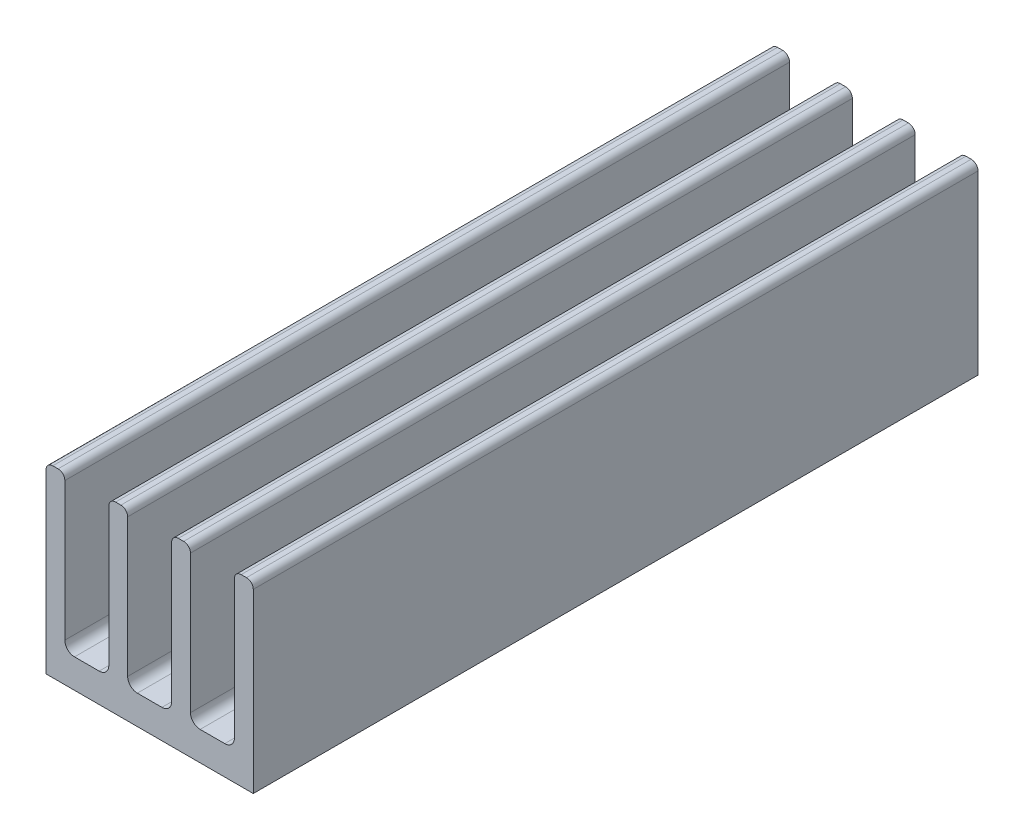
ISO-10303-21;
HEADER;
FILE_DESCRIPTION(('STEP AP214'),'2;1');
FILE_NAME('part.step','',(''),(''),'','','');
FILE_SCHEMA(('AUTOMOTIVE_DESIGN { 1 0 10303 214 1 1 1 1 }'));
ENDSEC;
DATA;
#1=APPLICATION_CONTEXT('core data for automotive mechanical design processes');
#2=APPLICATION_PROTOCOL_DEFINITION('international standard','automotive_design',2000,#1);
#3=PRODUCT_CONTEXT('',#1,'mechanical');
#4=PRODUCT('Part','Part','',(#3));
#5=PRODUCT_RELATED_PRODUCT_CATEGORY('part','',(#4));
#6=PRODUCT_DEFINITION_FORMATION('','',#4);
#7=PRODUCT_DEFINITION_CONTEXT('part definition',#1,'design');
#8=PRODUCT_DEFINITION('design','',#6,#7);
#9=PRODUCT_DEFINITION_SHAPE('','',#8);
#10=(LENGTH_UNIT() NAMED_UNIT(*) SI_UNIT(.MILLI.,.METRE.));
#11=(NAMED_UNIT(*) PLANE_ANGLE_UNIT() SI_UNIT($,.RADIAN.));
#12=(NAMED_UNIT(*) SI_UNIT($,.STERADIAN.) SOLID_ANGLE_UNIT());
#13=UNCERTAINTY_MEASURE_WITH_UNIT(LENGTH_MEASURE(1.E-05),#10,'distance_accuracy_value','');
#14=(GEOMETRIC_REPRESENTATION_CONTEXT(3) GLOBAL_UNCERTAINTY_ASSIGNED_CONTEXT((#13)) GLOBAL_UNIT_ASSIGNED_CONTEXT((#10,
#11,#12)) REPRESENTATION_CONTEXT('',''));
#15=CARTESIAN_POINT('',(0.,0.,0.));
#16=DIRECTION('',(0.,0.,1.));
#17=DIRECTION('',(1.,0.,0.));
#18=AXIS2_PLACEMENT_3D('',#15,#16,#17);
#19=CARTESIAN_POINT('',(9.49872014094311,4.,75.));
#20=DIRECTION('',(0.,0.,-1.));
#21=DIRECTION('',(-1.,0.,0.));
#22=AXIS2_PLACEMENT_3D('',#19,#20,#21);
#23=CYLINDRICAL_SURFACE('',#22,0.999999999999999);
#24=CARTESIAN_POINT('',(9.49872014094311,4.,0.));
#25=DIRECTION('',(0.,0.,-1.));
#26=DIRECTION('',(1.,0.,0.));
#27=AXIS2_PLACEMENT_3D('',#24,#25,#26);
#28=CIRCLE('',#27,0.999999999999999);
#29=CARTESIAN_POINT('',(9.49872014094311,3.,0.));
#30=VERTEX_POINT('',#29);
#31=CARTESIAN_POINT('',(8.49872014094311,4.,0.));
#32=VERTEX_POINT('',#31);
#33=EDGE_CURVE('E262',#30,#32,#28,.T.);
#34=ORIENTED_EDGE('',*,*,#33,.T.);
#35=DIRECTION('',(0.,0.,-1.));
#36=VECTOR('',#35,1.);
#37=CARTESIAN_POINT('',(8.49872014094311,4.,75.));
#38=LINE('',#37,#36);
#39=CARTESIAN_POINT('',(8.49872014094311,4.,75.));
#40=VERTEX_POINT('',#39);
#41=EDGE_CURVE('E11',#40,#32,#38,.T.);
#42=ORIENTED_EDGE('',*,*,#41,.F.);
#43=CARTESIAN_POINT('',(9.49872014094311,4.,75.));
#44=DIRECTION('',(0.,0.,-1.));
#45=DIRECTION('',(1.,0.,0.));
#46=AXIS2_PLACEMENT_3D('',#43,#44,#45);
#47=CIRCLE('',#46,0.999999999999999);
#48=CARTESIAN_POINT('',(9.49872014094311,3.,75.));
#49=VERTEX_POINT('',#48);
#50=EDGE_CURVE('E322',#49,#40,#47,.T.);
#51=ORIENTED_EDGE('',*,*,#50,.F.);
#52=DIRECTION('',(0.,0.,-1.));
#53=VECTOR('',#52,1.);
#54=CARTESIAN_POINT('',(9.49872014094311,3.,75.));
#55=LINE('',#54,#53);
#56=EDGE_CURVE('E258',#49,#30,#55,.T.);
#57=ORIENTED_EDGE('',*,*,#56,.T.);
#58=EDGE_LOOP('',(#34,#42,#51,#57));
#59=FACE_BOUND('',#58,.T.);
#60=ADVANCED_FACE('F33',(#59),#23,.F.);
#61=CARTESIAN_POINT('',(8.49872014094311,4.,75.));
#62=DIRECTION('',(-1.,0.,0.));
#63=DIRECTION('',(0.,-1.,0.));
#64=AXIS2_PLACEMENT_3D('',#61,#62,#63);
#65=PLANE('',#64);
#66=DIRECTION('',(0.,1.,0.));
#67=VECTOR('',#66,1.);
#68=CARTESIAN_POINT('',(8.49872014094311,4.,0.));
#69=LINE('',#68,#67);
#70=CARTESIAN_POINT('',(8.49872014094311,18.3,0.));
#71=VERTEX_POINT('',#70);
#72=EDGE_CURVE('E265',#32,#71,#69,.T.);
#73=ORIENTED_EDGE('',*,*,#72,.T.);
#74=DIRECTION('',(0.,0.,-1.));
#75=VECTOR('',#74,1.);
#76=CARTESIAN_POINT('',(8.49872014094311,18.3,75.));
#77=LINE('',#76,#75);
#78=CARTESIAN_POINT('',(8.49872014094311,18.3,75.));
#79=VERTEX_POINT('',#78);
#80=EDGE_CURVE('E41',#79,#71,#77,.T.);
#81=ORIENTED_EDGE('',*,*,#80,.F.);
#82=DIRECTION('',(0.,1.,0.));
#83=VECTOR('',#82,1.);
#84=CARTESIAN_POINT('',(8.49872014094311,4.,75.));
#85=LINE('',#84,#83);
#86=EDGE_CURVE('E156',#40,#79,#85,.T.);
#87=ORIENTED_EDGE('',*,*,#86,.F.);
#88=ORIENTED_EDGE('',*,*,#41,.T.);
#89=EDGE_LOOP('',(#73,#81,#87,#88));
#90=FACE_BOUND('',#89,.T.);
#91=ADVANCED_FACE('F480',(#90),#65,.F.);
#92=CARTESIAN_POINT('',(7.7987201409431,18.3,75.));
#93=DIRECTION('',(0.,0.,-1.));
#94=DIRECTION('',(-1.,0.,0.));
#95=AXIS2_PLACEMENT_3D('',#92,#93,#94);
#96=CYLINDRICAL_SURFACE('',#95,0.700000000000008);
#97=CARTESIAN_POINT('',(7.7987201409431,18.3,0.));
#98=DIRECTION('',(0.,0.,1.));
#99=DIRECTION('',(1.,0.,0.));
#100=AXIS2_PLACEMENT_3D('',#97,#98,#99);
#101=CIRCLE('',#100,0.700000000000008);
#102=CARTESIAN_POINT('',(7.7987201409431,19.,0.));
#103=VERTEX_POINT('',#102);
#104=EDGE_CURVE('E267',#71,#103,#101,.T.);
#105=ORIENTED_EDGE('',*,*,#104,.T.);
#106=DIRECTION('',(0.,0.,-1.));
#107=VECTOR('',#106,1.);
#108=CARTESIAN_POINT('',(7.7987201409431,19.,75.));
#109=LINE('',#108,#107);
#110=CARTESIAN_POINT('',(7.7987201409431,19.,75.));
#111=VERTEX_POINT('',#110);
#112=EDGE_CURVE('E395',#111,#103,#109,.T.);
#113=ORIENTED_EDGE('',*,*,#112,.F.);
#114=CARTESIAN_POINT('',(7.7987201409431,18.3,75.));
#115=DIRECTION('',(0.,0.,1.));
#116=DIRECTION('',(1.,0.,0.));
#117=AXIS2_PLACEMENT_3D('',#114,#115,#116);
#118=CIRCLE('',#117,0.700000000000008);
#119=EDGE_CURVE('E403',#79,#111,#118,.T.);
#120=ORIENTED_EDGE('',*,*,#119,.F.);
#121=ORIENTED_EDGE('',*,*,#80,.T.);
#122=EDGE_LOOP('',(#105,#113,#120,#121));
#123=FACE_BOUND('',#122,.T.);
#124=ADVANCED_FACE('F401',(#123),#96,.T.);
#125=CARTESIAN_POINT('',(7.7987201409431,19.,75.));
#126=DIRECTION('',(0.,-1.,0.));
#127=DIRECTION('',(0.,0.,-1.));
#128=AXIS2_PLACEMENT_3D('',#125,#126,#127);
#129=PLANE('',#128);
#130=DIRECTION('',(-1.,0.,0.));
#131=VECTOR('',#130,1.);
#132=CARTESIAN_POINT('',(7.7987201409431,19.,0.));
#133=LINE('',#132,#131);
#134=CARTESIAN_POINT('',(7.24872014094311,19.,0.));
#135=VERTEX_POINT('',#134);
#136=EDGE_CURVE('E269',#103,#135,#133,.T.);
#137=ORIENTED_EDGE('',*,*,#136,.T.);
#138=DIRECTION('',(0.,0.,-1.));
#139=VECTOR('',#138,1.);
#140=CARTESIAN_POINT('',(7.24872014094311,19.,75.));
#141=LINE('',#140,#139);
#142=CARTESIAN_POINT('',(7.24872014094311,19.,75.));
#143=VERTEX_POINT('',#142);
#144=EDGE_CURVE('E392',#143,#135,#141,.T.);
#145=ORIENTED_EDGE('',*,*,#144,.F.);
#146=DIRECTION('',(-1.,0.,0.));
#147=VECTOR('',#146,1.);
#148=CARTESIAN_POINT('',(7.7987201409431,19.,75.));
#149=LINE('',#148,#147);
#150=EDGE_CURVE('E419',#111,#143,#149,.T.);
#151=ORIENTED_EDGE('',*,*,#150,.F.);
#152=ORIENTED_EDGE('',*,*,#112,.T.);
#153=EDGE_LOOP('',(#137,#145,#151,#152));
#154=FACE_BOUND('',#153,.T.);
#155=ADVANCED_FACE('F410',(#154),#129,.F.);
#156=CARTESIAN_POINT('',(7.24872014094311,18.3,75.));
#157=DIRECTION('',(0.,0.,-1.));
#158=DIRECTION('',(-1.,0.,0.));
#159=AXIS2_PLACEMENT_3D('',#156,#157,#158);
#160=CYLINDRICAL_SURFACE('',#159,0.700000000000006);
#161=CARTESIAN_POINT('',(7.24872014094311,18.3,0.));
#162=DIRECTION('',(0.,0.,1.));
#163=DIRECTION('',(1.,0.,0.));
#164=AXIS2_PLACEMENT_3D('',#161,#162,#163);
#165=CIRCLE('',#164,0.700000000000006);
#166=CARTESIAN_POINT('',(6.5487201409431,18.3,0.));
#167=VERTEX_POINT('',#166);
#168=EDGE_CURVE('E271',#135,#167,#165,.T.);
#169=ORIENTED_EDGE('',*,*,#168,.T.);
#170=DIRECTION('',(0.,0.,-1.));
#171=VECTOR('',#170,1.);
#172=CARTESIAN_POINT('',(6.5487201409431,18.3,75.));
#173=LINE('',#172,#171);
#174=CARTESIAN_POINT('',(6.5487201409431,18.3,75.));
#175=VERTEX_POINT('',#174);
#176=EDGE_CURVE('E389',#175,#167,#173,.T.);
#177=ORIENTED_EDGE('',*,*,#176,.F.);
#178=CARTESIAN_POINT('',(7.24872014094311,18.3,75.));
#179=DIRECTION('',(0.,0.,1.));
#180=DIRECTION('',(1.,0.,0.));
#181=AXIS2_PLACEMENT_3D('',#178,#179,#180);
#182=CIRCLE('',#181,0.700000000000006);
#183=EDGE_CURVE('E416',#143,#175,#182,.T.);
#184=ORIENTED_EDGE('',*,*,#183,.F.);
#185=ORIENTED_EDGE('',*,*,#144,.T.);
#186=EDGE_LOOP('',(#169,#177,#184,#185));
#187=FACE_BOUND('',#186,.T.);
#188=ADVANCED_FACE('F414',(#187),#160,.T.);
#189=CARTESIAN_POINT('',(6.5487201409431,18.3,75.));
#190=DIRECTION('',(1.,0.,0.));
#191=DIRECTION('',(0.,0.,-1.));
#192=AXIS2_PLACEMENT_3D('',#189,#190,#191);
#193=PLANE('',#192);
#194=DIRECTION('',(0.,-1.,0.));
#195=VECTOR('',#194,1.);
#196=CARTESIAN_POINT('',(6.5487201409431,18.3,0.));
#197=LINE('',#196,#195);
#198=CARTESIAN_POINT('',(6.5487201409431,4.,0.));
#199=VERTEX_POINT('',#198);
#200=EDGE_CURVE('E273',#167,#199,#197,.T.);
#201=ORIENTED_EDGE('',*,*,#200,.T.);
#202=DIRECTION('',(0.,0.,-1.));
#203=VECTOR('',#202,1.);
#204=CARTESIAN_POINT('',(6.5487201409431,4.,75.));
#205=LINE('',#204,#203);
#206=CARTESIAN_POINT('',(6.5487201409431,4.,75.));
#207=VERTEX_POINT('',#206);
#208=EDGE_CURVE('E386',#207,#199,#205,.T.);
#209=ORIENTED_EDGE('',*,*,#208,.F.);
#210=DIRECTION('',(0.,-1.,0.));
#211=VECTOR('',#210,1.);
#212=CARTESIAN_POINT('',(6.5487201409431,18.3,75.));
#213=LINE('',#212,#211);
#214=EDGE_CURVE('E418',#175,#207,#213,.T.);
#215=ORIENTED_EDGE('',*,*,#214,.F.);
#216=ORIENTED_EDGE('',*,*,#176,.T.);
#217=EDGE_LOOP('',(#201,#209,#215,#216));
#218=FACE_BOUND('',#217,.T.);
#219=ADVANCED_FACE('F492',(#218),#193,.F.);
#220=CARTESIAN_POINT('',(5.5487201409431,4.,75.));
#221=DIRECTION('',(0.,0.,-1.));
#222=DIRECTION('',(-1.,0.,0.));
#223=AXIS2_PLACEMENT_3D('',#220,#221,#222);
#224=CYLINDRICAL_SURFACE('',#223,0.999999999999999);
#225=CARTESIAN_POINT('',(5.5487201409431,4.,0.));
#226=DIRECTION('',(0.,0.,-1.));
#227=DIRECTION('',(1.,0.,0.));
#228=AXIS2_PLACEMENT_3D('',#225,#226,#227);
#229=CIRCLE('',#228,0.999999999999999);
#230=CARTESIAN_POINT('',(5.5487201409431,3.,0.));
#231=VERTEX_POINT('',#230);
#232=EDGE_CURVE('E275',#199,#231,#229,.T.);
#233=ORIENTED_EDGE('',*,*,#232,.T.);
#234=DIRECTION('',(0.,0.,-1.));
#235=VECTOR('',#234,1.);
#236=CARTESIAN_POINT('',(5.5487201409431,3.,75.));
#237=LINE('',#236,#235);
#238=CARTESIAN_POINT('',(5.5487201409431,3.,75.));
#239=VERTEX_POINT('',#238);
#240=EDGE_CURVE('E383',#239,#231,#237,.T.);
#241=ORIENTED_EDGE('',*,*,#240,.F.);
#242=CARTESIAN_POINT('',(5.5487201409431,4.,75.));
#243=DIRECTION('',(0.,0.,-1.));
#244=DIRECTION('',(1.,0.,0.));
#245=AXIS2_PLACEMENT_3D('',#242,#243,#244);
#246=CIRCLE('',#245,0.999999999999999);
#247=EDGE_CURVE('E421',#207,#239,#246,.T.);
#248=ORIENTED_EDGE('',*,*,#247,.F.);
#249=ORIENTED_EDGE('',*,*,#208,.T.);
#250=EDGE_LOOP('',(#233,#241,#248,#249));
#251=FACE_BOUND('',#250,.T.);
#252=ADVANCED_FACE('F495',(#251),#224,.F.);
#253=CARTESIAN_POINT('',(5.5487201409431,3.,75.));
#254=DIRECTION('',(0.,-1.,0.));
#255=DIRECTION('',(0.,0.,-1.));
#256=AXIS2_PLACEMENT_3D('',#253,#254,#255);
#257=PLANE('',#256);
#258=DIRECTION('',(-1.,0.,0.));
#259=VECTOR('',#258,1.);
#260=CARTESIAN_POINT('',(5.5487201409431,3.,0.));
#261=LINE('',#260,#259);
#262=CARTESIAN_POINT('',(2.99872014094311,3.,0.));
#263=VERTEX_POINT('',#262);
#264=EDGE_CURVE('E277',#231,#263,#261,.T.);
#265=ORIENTED_EDGE('',*,*,#264,.T.);
#266=DIRECTION('',(0.,0.,-1.));
#267=VECTOR('',#266,1.);
#268=CARTESIAN_POINT('',(2.99872014094311,3.,75.));
#269=LINE('',#268,#267);
#270=CARTESIAN_POINT('',(2.99872014094311,3.,75.));
#271=VERTEX_POINT('',#270);
#272=EDGE_CURVE('E380',#271,#263,#269,.T.);
#273=ORIENTED_EDGE('',*,*,#272,.F.);
#274=DIRECTION('',(-1.,0.,0.));
#275=VECTOR('',#274,1.);
#276=CARTESIAN_POINT('',(5.5487201409431,3.,75.));
#277=LINE('',#276,#275);
#278=EDGE_CURVE('E427',#239,#271,#277,.T.);
#279=ORIENTED_EDGE('',*,*,#278,.F.);
#280=ORIENTED_EDGE('',*,*,#240,.T.);
#281=EDGE_LOOP('',(#265,#273,#279,#280));
#282=FACE_BOUND('',#281,.T.);
#283=ADVANCED_FACE('F499',(#282),#257,.F.);
#284=CARTESIAN_POINT('',(2.99872014094311,4.,75.));
#285=DIRECTION('',(0.,0.,-1.));
#286=DIRECTION('',(-1.,0.,0.));
#287=AXIS2_PLACEMENT_3D('',#284,#285,#286);
#288=CYLINDRICAL_SURFACE('',#287,1.);
#289=CARTESIAN_POINT('',(2.99872014094311,4.,0.));
#290=DIRECTION('',(0.,0.,-1.));
#291=DIRECTION('',(1.,0.,0.));
#292=AXIS2_PLACEMENT_3D('',#289,#290,#291);
#293=CIRCLE('',#292,1.);
#294=CARTESIAN_POINT('',(1.99872014094311,4.,0.));
#295=VERTEX_POINT('',#294);
#296=EDGE_CURVE('E279',#263,#295,#293,.T.);
#297=ORIENTED_EDGE('',*,*,#296,.T.);
#298=DIRECTION('',(0.,0.,-1.));
#299=VECTOR('',#298,1.);
#300=CARTESIAN_POINT('',(1.99872014094311,4.,75.));
#301=LINE('',#300,#299);
#302=CARTESIAN_POINT('',(1.99872014094311,4.,75.));
#303=VERTEX_POINT('',#302);
#304=EDGE_CURVE('E377',#303,#295,#301,.T.);
#305=ORIENTED_EDGE('',*,*,#304,.F.);
#306=CARTESIAN_POINT('',(2.99872014094311,4.,75.));
#307=DIRECTION('',(0.,0.,-1.));
#308=DIRECTION('',(1.,0.,0.));
#309=AXIS2_PLACEMENT_3D('',#306,#307,#308);
#310=CIRCLE('',#309,1.);
#311=EDGE_CURVE('E429',#271,#303,#310,.T.);
#312=ORIENTED_EDGE('',*,*,#311,.F.);
#313=ORIENTED_EDGE('',*,*,#272,.T.);
#314=EDGE_LOOP('',(#297,#305,#312,#313));
#315=FACE_BOUND('',#314,.T.);
#316=ADVANCED_FACE('F503',(#315),#288,.F.);
#317=CARTESIAN_POINT('',(1.99872014094311,4.,75.));
#318=DIRECTION('',(-1.,0.,0.));
#319=DIRECTION('',(0.,-1.,0.));
#320=AXIS2_PLACEMENT_3D('',#317,#318,#319);
#321=PLANE('',#320);
#322=DIRECTION('',(0.,1.,0.));
#323=VECTOR('',#322,1.);
#324=CARTESIAN_POINT('',(1.99872014094311,4.,0.));
#325=LINE('',#324,#323);
#326=CARTESIAN_POINT('',(1.99872014094311,18.3,0.));
#327=VERTEX_POINT('',#326);
#328=EDGE_CURVE('E281',#295,#327,#325,.T.);
#329=ORIENTED_EDGE('',*,*,#328,.T.);
#330=DIRECTION('',(0.,0.,-1.));
#331=VECTOR('',#330,1.);
#332=CARTESIAN_POINT('',(1.99872014094311,18.3,75.));
#333=LINE('',#332,#331);
#334=CARTESIAN_POINT('',(1.99872014094311,18.3,75.));
#335=VERTEX_POINT('',#334);
#336=EDGE_CURVE('E374',#335,#327,#333,.T.);
#337=ORIENTED_EDGE('',*,*,#336,.F.);
#338=DIRECTION('',(0.,1.,0.));
#339=VECTOR('',#338,1.);
#340=CARTESIAN_POINT('',(1.99872014094311,4.,75.));
#341=LINE('',#340,#339);
#342=EDGE_CURVE('E431',#303,#335,#341,.T.);
#343=ORIENTED_EDGE('',*,*,#342,.F.);
#344=ORIENTED_EDGE('',*,*,#304,.T.);
#345=EDGE_LOOP('',(#329,#337,#343,#344));
#346=FACE_BOUND('',#345,.T.);
#347=ADVANCED_FACE('F507',(#346),#321,.F.);
#348=CARTESIAN_POINT('',(1.2987201409431,18.3,75.));
#349=DIRECTION('',(0.,0.,-1.));
#350=DIRECTION('',(-1.,0.,0.));
#351=AXIS2_PLACEMENT_3D('',#348,#349,#350);
#352=CYLINDRICAL_SURFACE('',#351,0.700000000000009);
#353=CARTESIAN_POINT('',(1.2987201409431,18.3,0.));
#354=DIRECTION('',(0.,0.,1.));
#355=DIRECTION('',(1.,0.,0.));
#356=AXIS2_PLACEMENT_3D('',#353,#354,#355);
#357=CIRCLE('',#356,0.700000000000009);
#358=CARTESIAN_POINT('',(1.2987201409431,19.,0.));
#359=VERTEX_POINT('',#358);
#360=EDGE_CURVE('E283',#327,#359,#357,.T.);
#361=ORIENTED_EDGE('',*,*,#360,.T.);
#362=DIRECTION('',(0.,0.,-1.));
#363=VECTOR('',#362,1.);
#364=CARTESIAN_POINT('',(1.2987201409431,19.,75.));
#365=LINE('',#364,#363);
#366=CARTESIAN_POINT('',(1.2987201409431,19.,75.));
#367=VERTEX_POINT('',#366);
#368=EDGE_CURVE('E371',#367,#359,#365,.T.);
#369=ORIENTED_EDGE('',*,*,#368,.F.);
#370=CARTESIAN_POINT('',(1.2987201409431,18.3,75.));
#371=DIRECTION('',(0.,0.,1.));
#372=DIRECTION('',(1.,0.,0.));
#373=AXIS2_PLACEMENT_3D('',#370,#371,#372);
#374=CIRCLE('',#373,0.700000000000009);
#375=EDGE_CURVE('E433',#335,#367,#374,.T.);
#376=ORIENTED_EDGE('',*,*,#375,.F.);
#377=ORIENTED_EDGE('',*,*,#336,.T.);
#378=EDGE_LOOP('',(#361,#369,#376,#377));
#379=FACE_BOUND('',#378,.T.);
#380=ADVANCED_FACE('F511',(#379),#352,.T.);
#381=CARTESIAN_POINT('',(1.2987201409431,19.,75.));
#382=DIRECTION('',(0.,-1.,0.));
#383=DIRECTION('',(1.,0.,0.));
#384=AXIS2_PLACEMENT_3D('',#381,#382,#383);
#385=PLANE('',#384);
#386=DIRECTION('',(-1.,0.,0.));
#387=VECTOR('',#386,1.);
#388=CARTESIAN_POINT('',(1.2987201409431,19.,0.));
#389=LINE('',#388,#387);
#390=CARTESIAN_POINT('',(0.748720140943107,19.,0.));
#391=VERTEX_POINT('',#390);
#392=EDGE_CURVE('E285',#359,#391,#389,.T.);
#393=ORIENTED_EDGE('',*,*,#392,.T.);
#394=DIRECTION('',(0.,0.,-1.));
#395=VECTOR('',#394,1.);
#396=CARTESIAN_POINT('',(0.748720140943107,19.,75.));
#397=LINE('',#396,#395);
#398=CARTESIAN_POINT('',(0.748720140943107,19.,75.));
#399=VERTEX_POINT('',#398);
#400=EDGE_CURVE('E368',#399,#391,#397,.T.);
#401=ORIENTED_EDGE('',*,*,#400,.F.);
#402=DIRECTION('',(-1.,0.,0.));
#403=VECTOR('',#402,1.);
#404=CARTESIAN_POINT('',(1.2987201409431,19.,75.));
#405=LINE('',#404,#403);
#406=EDGE_CURVE('E435',#367,#399,#405,.T.);
#407=ORIENTED_EDGE('',*,*,#406,.F.);
#408=ORIENTED_EDGE('',*,*,#368,.T.);
#409=EDGE_LOOP('',(#393,#401,#407,#408));
#410=FACE_BOUND('',#409,.T.);
#411=ADVANCED_FACE('F515',(#410),#385,.F.);
#412=CARTESIAN_POINT('',(0.748720140943105,18.3,75.));
#413=DIRECTION('',(0.,0.,-1.));
#414=DIRECTION('',(-1.,0.,0.));
#415=AXIS2_PLACEMENT_3D('',#412,#413,#414);
#416=CYLINDRICAL_SURFACE('',#415,0.700000000000002);
#417=CARTESIAN_POINT('',(0.748720140943105,18.3,0.));
#418=DIRECTION('',(0.,0.,1.));
#419=DIRECTION('',(1.,0.,0.));
#420=AXIS2_PLACEMENT_3D('',#417,#418,#419);
#421=CIRCLE('',#420,0.700000000000002);
#422=CARTESIAN_POINT('',(0.0487201409431028,18.3,0.));
#423=VERTEX_POINT('',#422);
#424=EDGE_CURVE('E287',#391,#423,#421,.T.);
#425=ORIENTED_EDGE('',*,*,#424,.T.);
#426=DIRECTION('',(0.,0.,-1.));
#427=VECTOR('',#426,1.);
#428=CARTESIAN_POINT('',(0.0487201409431028,18.3,75.));
#429=LINE('',#428,#427);
#430=CARTESIAN_POINT('',(0.0487201409431028,18.3,75.));
#431=VERTEX_POINT('',#430);
#432=EDGE_CURVE('E365',#431,#423,#429,.T.);
#433=ORIENTED_EDGE('',*,*,#432,.F.);
#434=CARTESIAN_POINT('',(0.748720140943105,18.3,75.));
#435=DIRECTION('',(0.,0.,1.));
#436=DIRECTION('',(1.,0.,0.));
#437=AXIS2_PLACEMENT_3D('',#434,#435,#436);
#438=CIRCLE('',#437,0.700000000000002);
#439=EDGE_CURVE('E437',#399,#431,#438,.T.);
#440=ORIENTED_EDGE('',*,*,#439,.F.);
#441=ORIENTED_EDGE('',*,*,#400,.T.);
#442=EDGE_LOOP('',(#425,#433,#440,#441));
#443=FACE_BOUND('',#442,.T.);
#444=ADVANCED_FACE('F519',(#443),#416,.T.);
#445=CARTESIAN_POINT('',(0.0487201409431037,18.3,75.));
#446=DIRECTION('',(1.,0.,0.));
#447=DIRECTION('',(0.,0.,-1.));
#448=AXIS2_PLACEMENT_3D('',#445,#446,#447);
#449=PLANE('',#448);
#450=DIRECTION('',(0.,-1.,0.));
#451=VECTOR('',#450,1.);
#452=CARTESIAN_POINT('',(0.0487201409431037,18.3,0.));
#453=LINE('',#452,#451);
#454=CARTESIAN_POINT('',(0.0487201409431037,0.,0.));
#455=VERTEX_POINT('',#454);
#456=EDGE_CURVE('E289',#423,#455,#453,.T.);
#457=ORIENTED_EDGE('',*,*,#456,.T.);
#458=DIRECTION('',(0.,0.,-1.));
#459=VECTOR('',#458,1.);
#460=CARTESIAN_POINT('',(0.0487201409431037,0.,75.));
#461=LINE('',#460,#459);
#462=CARTESIAN_POINT('',(0.0487201409431037,0.,75.));
#463=VERTEX_POINT('',#462);
#464=EDGE_CURVE('E362',#463,#455,#461,.T.);
#465=ORIENTED_EDGE('',*,*,#464,.F.);
#466=DIRECTION('',(0.,-1.,0.));
#467=VECTOR('',#466,1.);
#468=CARTESIAN_POINT('',(0.0487201409431037,18.3,75.));
#469=LINE('',#468,#467);
#470=EDGE_CURVE('E439',#431,#463,#469,.T.);
#471=ORIENTED_EDGE('',*,*,#470,.F.);
#472=ORIENTED_EDGE('',*,*,#432,.T.);
#473=EDGE_LOOP('',(#457,#465,#471,#472));
#474=FACE_BOUND('',#473,.T.);
#475=ADVANCED_FACE('F523',(#474),#449,.F.);
#476=CARTESIAN_POINT('',(10.7737201409431,0.,75.));
#477=DIRECTION('',(0.,1.,0.));
#478=DIRECTION('',(0.,0.,1.));
#479=AXIS2_PLACEMENT_3D('',#476,#477,#478);
#480=PLANE('',#479);
#481=DIRECTION('',(1.,0.,0.));
#482=VECTOR('',#481,1.);
#483=CARTESIAN_POINT('',(10.7737201409431,0.,0.));
#484=LINE('',#483,#482);
#485=CARTESIAN_POINT('',(21.4987201409431,0.,0.));
#486=VERTEX_POINT('',#485);
#487=EDGE_CURVE('E292',#455,#486,#484,.T.);
#488=ORIENTED_EDGE('',*,*,#487,.T.);
#489=DIRECTION('',(0.,0.,-1.));
#490=VECTOR('',#489,1.);
#491=CARTESIAN_POINT('',(21.4987201409431,0.,75.));
#492=LINE('',#491,#490);
#493=CARTESIAN_POINT('',(21.4987201409431,0.,75.));
#494=VERTEX_POINT('',#493);
#495=EDGE_CURVE('E359',#494,#486,#492,.T.);
#496=ORIENTED_EDGE('',*,*,#495,.F.);
#497=DIRECTION('',(1.,0.,0.));
#498=VECTOR('',#497,1.);
#499=CARTESIAN_POINT('',(0.0487201409431037,0.,75.));
#500=LINE('',#499,#498);
#501=EDGE_CURVE('E441',#463,#494,#500,.T.);
#502=ORIENTED_EDGE('',*,*,#501,.F.);
#503=ORIENTED_EDGE('',*,*,#464,.T.);
#504=EDGE_LOOP('',(#488,#496,#502,#503));
#505=FACE_BOUND('',#504,.T.);
#506=ADVANCED_FACE('F527',(#505),#480,.F.);
#507=CARTESIAN_POINT('',(21.4987201409431,0.,75.));
#508=DIRECTION('',(-1.,0.,0.));
#509=DIRECTION('',(0.,0.,1.));
#510=AXIS2_PLACEMENT_3D('',#507,#508,#509);
#511=PLANE('',#510);
#512=DIRECTION('',(0.,1.,0.));
#513=VECTOR('',#512,1.);
#514=CARTESIAN_POINT('',(21.4987201409431,0.,0.));
#515=LINE('',#514,#513);
#516=CARTESIAN_POINT('',(21.4987201409431,18.3,0.));
#517=VERTEX_POINT('',#516);
#518=EDGE_CURVE('E294',#486,#517,#515,.T.);
#519=ORIENTED_EDGE('',*,*,#518,.T.);
#520=DIRECTION('',(0.,0.,-1.));
#521=VECTOR('',#520,1.);
#522=CARTESIAN_POINT('',(21.4987201409431,18.3,75.));
#523=LINE('',#522,#521);
#524=CARTESIAN_POINT('',(21.4987201409431,18.3,75.));
#525=VERTEX_POINT('',#524);
#526=EDGE_CURVE('E356',#525,#517,#523,.T.);
#527=ORIENTED_EDGE('',*,*,#526,.F.);
#528=DIRECTION('',(0.,1.,0.));
#529=VECTOR('',#528,1.);
#530=CARTESIAN_POINT('',(21.4987201409431,0.,75.));
#531=LINE('',#530,#529);
#532=EDGE_CURVE('E443',#494,#525,#531,.T.);
#533=ORIENTED_EDGE('',*,*,#532,.F.);
#534=ORIENTED_EDGE('',*,*,#495,.T.);
#535=EDGE_LOOP('',(#519,#527,#533,#534));
#536=FACE_BOUND('',#535,.T.);
#537=ADVANCED_FACE('F531',(#536),#511,.F.);
#538=CARTESIAN_POINT('',(20.7987201409431,18.3,75.));
#539=DIRECTION('',(0.,0.,-1.));
#540=DIRECTION('',(-1.,0.,0.));
#541=AXIS2_PLACEMENT_3D('',#538,#539,#540);
#542=CYLINDRICAL_SURFACE('',#541,0.699999999999999);
#543=CARTESIAN_POINT('',(20.7987201409431,18.3,0.));
#544=DIRECTION('',(0.,0.,1.));
#545=DIRECTION('',(1.,0.,0.));
#546=AXIS2_PLACEMENT_3D('',#543,#544,#545);
#547=CIRCLE('',#546,0.699999999999999);
#548=CARTESIAN_POINT('',(20.7987201409431,19.,0.));
#549=VERTEX_POINT('',#548);
#550=EDGE_CURVE('E296',#517,#549,#547,.T.);
#551=ORIENTED_EDGE('',*,*,#550,.T.);
#552=DIRECTION('',(0.,0.,-1.));
#553=VECTOR('',#552,1.);
#554=CARTESIAN_POINT('',(20.7987201409431,19.,75.));
#555=LINE('',#554,#553);
#556=CARTESIAN_POINT('',(20.7987201409431,19.,75.));
#557=VERTEX_POINT('',#556);
#558=EDGE_CURVE('E353',#557,#549,#555,.T.);
#559=ORIENTED_EDGE('',*,*,#558,.F.);
#560=CARTESIAN_POINT('',(20.7987201409431,18.3,75.));
#561=DIRECTION('',(0.,0.,1.));
#562=DIRECTION('',(1.,0.,0.));
#563=AXIS2_PLACEMENT_3D('',#560,#561,#562);
#564=CIRCLE('',#563,0.699999999999999);
#565=EDGE_CURVE('E445',#525,#557,#564,.T.);
#566=ORIENTED_EDGE('',*,*,#565,.F.);
#567=ORIENTED_EDGE('',*,*,#526,.T.);
#568=EDGE_LOOP('',(#551,#559,#566,#567));
#569=FACE_BOUND('',#568,.T.);
#570=ADVANCED_FACE('F535',(#569),#542,.T.);
#571=CARTESIAN_POINT('',(20.7987201409431,19.,75.));
#572=DIRECTION('',(0.,-1.,0.));
#573=DIRECTION('',(1.,0.,0.));
#574=AXIS2_PLACEMENT_3D('',#571,#572,#573);
#575=PLANE('',#574);
#576=DIRECTION('',(-1.,0.,0.));
#577=VECTOR('',#576,1.);
#578=CARTESIAN_POINT('',(20.7987201409431,19.,0.));
#579=LINE('',#578,#577);
#580=CARTESIAN_POINT('',(20.2487201409431,19.,0.));
#581=VERTEX_POINT('',#580);
#582=EDGE_CURVE('E298',#549,#581,#579,.T.);
#583=ORIENTED_EDGE('',*,*,#582,.T.);
#584=DIRECTION('',(0.,0.,-1.));
#585=VECTOR('',#584,1.);
#586=CARTESIAN_POINT('',(20.2487201409431,19.,75.));
#587=LINE('',#586,#585);
#588=CARTESIAN_POINT('',(20.2487201409431,19.,75.));
#589=VERTEX_POINT('',#588);
#590=EDGE_CURVE('E350',#589,#581,#587,.T.);
#591=ORIENTED_EDGE('',*,*,#590,.F.);
#592=DIRECTION('',(-1.,0.,0.));
#593=VECTOR('',#592,1.);
#594=CARTESIAN_POINT('',(20.7987201409431,19.,75.));
#595=LINE('',#594,#593);
#596=EDGE_CURVE('E447',#557,#589,#595,.T.);
#597=ORIENTED_EDGE('',*,*,#596,.F.);
#598=ORIENTED_EDGE('',*,*,#558,.T.);
#599=EDGE_LOOP('',(#583,#591,#597,#598));
#600=FACE_BOUND('',#599,.T.);
#601=ADVANCED_FACE('F539',(#600),#575,.F.);
#602=CARTESIAN_POINT('',(20.2487201409431,18.3,75.));
#603=DIRECTION('',(0.,0.,-1.));
#604=DIRECTION('',(-1.,0.,0.));
#605=AXIS2_PLACEMENT_3D('',#602,#603,#604);
#606=CYLINDRICAL_SURFACE('',#605,0.70000000000001);
#607=CARTESIAN_POINT('',(20.2487201409431,18.3,0.));
#608=DIRECTION('',(0.,0.,1.));
#609=DIRECTION('',(1.,0.,0.));
#610=AXIS2_PLACEMENT_3D('',#607,#608,#609);
#611=CIRCLE('',#610,0.70000000000001);
#612=CARTESIAN_POINT('',(19.5487201409431,18.3,0.));
#613=VERTEX_POINT('',#612);
#614=EDGE_CURVE('E300',#581,#613,#611,.T.);
#615=ORIENTED_EDGE('',*,*,#614,.T.);
#616=DIRECTION('',(0.,0.,-1.));
#617=VECTOR('',#616,1.);
#618=CARTESIAN_POINT('',(19.5487201409431,18.3,75.));
#619=LINE('',#618,#617);
#620=CARTESIAN_POINT('',(19.5487201409431,18.3,75.));
#621=VERTEX_POINT('',#620);
#622=EDGE_CURVE('E347',#621,#613,#619,.T.);
#623=ORIENTED_EDGE('',*,*,#622,.F.);
#624=CARTESIAN_POINT('',(20.2487201409431,18.3,75.));
#625=DIRECTION('',(0.,0.,1.));
#626=DIRECTION('',(1.,0.,0.));
#627=AXIS2_PLACEMENT_3D('',#624,#625,#626);
#628=CIRCLE('',#627,0.70000000000001);
#629=EDGE_CURVE('E449',#589,#621,#628,.T.);
#630=ORIENTED_EDGE('',*,*,#629,.F.);
#631=ORIENTED_EDGE('',*,*,#590,.T.);
#632=EDGE_LOOP('',(#615,#623,#630,#631));
#633=FACE_BOUND('',#632,.T.);
#634=ADVANCED_FACE('F543',(#633),#606,.T.);
#635=CARTESIAN_POINT('',(19.5487201409431,18.3,75.));
#636=DIRECTION('',(1.,0.,0.));
#637=DIRECTION('',(0.,1.,0.));
#638=AXIS2_PLACEMENT_3D('',#635,#636,#637);
#639=PLANE('',#638);
#640=DIRECTION('',(0.,-1.,0.));
#641=VECTOR('',#640,1.);
#642=CARTESIAN_POINT('',(19.5487201409431,18.3,0.));
#643=LINE('',#642,#641);
#644=CARTESIAN_POINT('',(19.5487201409431,4.,0.));
#645=VERTEX_POINT('',#644);
#646=EDGE_CURVE('E302',#613,#645,#643,.T.);
#647=ORIENTED_EDGE('',*,*,#646,.T.);
#648=DIRECTION('',(0.,0.,-1.));
#649=VECTOR('',#648,1.);
#650=CARTESIAN_POINT('',(19.5487201409431,4.,75.));
#651=LINE('',#650,#649);
#652=CARTESIAN_POINT('',(19.5487201409431,4.,75.));
#653=VERTEX_POINT('',#652);
#654=EDGE_CURVE('E344',#653,#645,#651,.T.);
#655=ORIENTED_EDGE('',*,*,#654,.F.);
#656=DIRECTION('',(0.,-1.,0.));
#657=VECTOR('',#656,1.);
#658=CARTESIAN_POINT('',(19.5487201409431,18.3,75.));
#659=LINE('',#658,#657);
#660=EDGE_CURVE('E451',#621,#653,#659,.T.);
#661=ORIENTED_EDGE('',*,*,#660,.F.);
#662=ORIENTED_EDGE('',*,*,#622,.T.);
#663=EDGE_LOOP('',(#647,#655,#661,#662));
#664=FACE_BOUND('',#663,.T.);
#665=ADVANCED_FACE('F547',(#664),#639,.F.);
#666=CARTESIAN_POINT('',(18.5487201409431,4.,75.));
#667=DIRECTION('',(0.,0.,-1.));
#668=DIRECTION('',(-1.,0.,0.));
#669=AXIS2_PLACEMENT_3D('',#666,#667,#668);
#670=CYLINDRICAL_SURFACE('',#669,1.);
#671=CARTESIAN_POINT('',(18.5487201409431,4.,0.));
#672=DIRECTION('',(0.,0.,-1.));
#673=DIRECTION('',(1.,0.,0.));
#674=AXIS2_PLACEMENT_3D('',#671,#672,#673);
#675=CIRCLE('',#674,1.);
#676=CARTESIAN_POINT('',(18.5487201409431,3.,0.));
#677=VERTEX_POINT('',#676);
#678=EDGE_CURVE('E304',#645,#677,#675,.T.);
#679=ORIENTED_EDGE('',*,*,#678,.T.);
#680=DIRECTION('',(0.,0.,-1.));
#681=VECTOR('',#680,1.);
#682=CARTESIAN_POINT('',(18.5487201409431,3.,75.));
#683=LINE('',#682,#681);
#684=CARTESIAN_POINT('',(18.5487201409431,3.,75.));
#685=VERTEX_POINT('',#684);
#686=EDGE_CURVE('E341',#685,#677,#683,.T.);
#687=ORIENTED_EDGE('',*,*,#686,.F.);
#688=CARTESIAN_POINT('',(18.5487201409431,4.,75.));
#689=DIRECTION('',(0.,0.,-1.));
#690=DIRECTION('',(1.,0.,0.));
#691=AXIS2_PLACEMENT_3D('',#688,#689,#690);
#692=CIRCLE('',#691,1.);
#693=EDGE_CURVE('E453',#653,#685,#692,.T.);
#694=ORIENTED_EDGE('',*,*,#693,.F.);
#695=ORIENTED_EDGE('',*,*,#654,.T.);
#696=EDGE_LOOP('',(#679,#687,#694,#695));
#697=FACE_BOUND('',#696,.T.);
#698=ADVANCED_FACE('F551',(#697),#670,.F.);
#699=CARTESIAN_POINT('',(18.5487201409431,3.,75.));
#700=DIRECTION('',(0.,-1.,0.));
#701=DIRECTION('',(0.,0.,-1.));
#702=AXIS2_PLACEMENT_3D('',#699,#700,#701);
#703=PLANE('',#702);
#704=DIRECTION('',(-1.,0.,0.));
#705=VECTOR('',#704,1.);
#706=CARTESIAN_POINT('',(18.5487201409431,3.,0.));
#707=LINE('',#706,#705);
#708=CARTESIAN_POINT('',(15.9987201409431,3.,0.));
#709=VERTEX_POINT('',#708);
#710=EDGE_CURVE('E306',#677,#709,#707,.T.);
#711=ORIENTED_EDGE('',*,*,#710,.T.);
#712=DIRECTION('',(0.,0.,-1.));
#713=VECTOR('',#712,1.);
#714=CARTESIAN_POINT('',(15.9987201409431,3.,75.));
#715=LINE('',#714,#713);
#716=CARTESIAN_POINT('',(15.9987201409431,3.,75.));
#717=VERTEX_POINT('',#716);
#718=EDGE_CURVE('E338',#717,#709,#715,.T.);
#719=ORIENTED_EDGE('',*,*,#718,.F.);
#720=DIRECTION('',(-1.,0.,0.));
#721=VECTOR('',#720,1.);
#722=CARTESIAN_POINT('',(18.5487201409431,3.,75.));
#723=LINE('',#722,#721);
#724=EDGE_CURVE('E455',#685,#717,#723,.T.);
#725=ORIENTED_EDGE('',*,*,#724,.F.);
#726=ORIENTED_EDGE('',*,*,#686,.T.);
#727=EDGE_LOOP('',(#711,#719,#725,#726));
#728=FACE_BOUND('',#727,.T.);
#729=ADVANCED_FACE('F555',(#728),#703,.F.);
#730=CARTESIAN_POINT('',(15.9987201409431,4.,75.));
#731=DIRECTION('',(0.,0.,-1.));
#732=DIRECTION('',(-1.,0.,0.));
#733=AXIS2_PLACEMENT_3D('',#730,#731,#732);
#734=CYLINDRICAL_SURFACE('',#733,0.999999999999999);
#735=CARTESIAN_POINT('',(15.9987201409431,4.,0.));
#736=DIRECTION('',(0.,0.,-1.));
#737=DIRECTION('',(1.,0.,0.));
#738=AXIS2_PLACEMENT_3D('',#735,#736,#737);
#739=CIRCLE('',#738,0.999999999999999);
#740=CARTESIAN_POINT('',(14.9987201409431,4.,0.));
#741=VERTEX_POINT('',#740);
#742=EDGE_CURVE('E308',#709,#741,#739,.T.);
#743=ORIENTED_EDGE('',*,*,#742,.T.);
#744=DIRECTION('',(0.,0.,-1.));
#745=VECTOR('',#744,1.);
#746=CARTESIAN_POINT('',(14.9987201409431,4.,75.));
#747=LINE('',#746,#745);
#748=CARTESIAN_POINT('',(14.9987201409431,4.,75.));
#749=VERTEX_POINT('',#748);
#750=EDGE_CURVE('E335',#749,#741,#747,.T.);
#751=ORIENTED_EDGE('',*,*,#750,.F.);
#752=CARTESIAN_POINT('',(15.9987201409431,4.,75.));
#753=DIRECTION('',(0.,0.,-1.));
#754=DIRECTION('',(1.,0.,0.));
#755=AXIS2_PLACEMENT_3D('',#752,#753,#754);
#756=CIRCLE('',#755,0.999999999999999);
#757=EDGE_CURVE('E457',#717,#749,#756,.T.);
#758=ORIENTED_EDGE('',*,*,#757,.F.);
#759=ORIENTED_EDGE('',*,*,#718,.T.);
#760=EDGE_LOOP('',(#743,#751,#758,#759));
#761=FACE_BOUND('',#760,.T.);
#762=ADVANCED_FACE('F559',(#761),#734,.F.);
#763=CARTESIAN_POINT('',(14.9987201409431,4.,75.));
#764=DIRECTION('',(-1.,0.,0.));
#765=DIRECTION('',(0.,0.,1.));
#766=AXIS2_PLACEMENT_3D('',#763,#764,#765);
#767=PLANE('',#766);
#768=DIRECTION('',(0.,1.,0.));
#769=VECTOR('',#768,1.);
#770=CARTESIAN_POINT('',(14.9987201409431,4.,0.));
#771=LINE('',#770,#769);
#772=CARTESIAN_POINT('',(14.9987201409431,18.3,0.));
#773=VERTEX_POINT('',#772);
#774=EDGE_CURVE('E310',#741,#773,#771,.T.);
#775=ORIENTED_EDGE('',*,*,#774,.T.);
#776=DIRECTION('',(0.,0.,-1.));
#777=VECTOR('',#776,1.);
#778=CARTESIAN_POINT('',(14.9987201409431,18.3,75.));
#779=LINE('',#778,#777);
#780=CARTESIAN_POINT('',(14.9987201409431,18.3,75.));
#781=VERTEX_POINT('',#780);
#782=EDGE_CURVE('E332',#781,#773,#779,.T.);
#783=ORIENTED_EDGE('',*,*,#782,.F.);
#784=DIRECTION('',(0.,1.,0.));
#785=VECTOR('',#784,1.);
#786=CARTESIAN_POINT('',(14.9987201409431,4.,75.));
#787=LINE('',#786,#785);
#788=EDGE_CURVE('E459',#749,#781,#787,.T.);
#789=ORIENTED_EDGE('',*,*,#788,.F.);
#790=ORIENTED_EDGE('',*,*,#750,.T.);
#791=EDGE_LOOP('',(#775,#783,#789,#790));
#792=FACE_BOUND('',#791,.T.);
#793=ADVANCED_FACE('F563',(#792),#767,.F.);
#794=CARTESIAN_POINT('',(14.2987201409431,18.3,75.));
#795=DIRECTION('',(0.,0.,-1.));
#796=DIRECTION('',(-1.,0.,0.));
#797=AXIS2_PLACEMENT_3D('',#794,#795,#796);
#798=CYLINDRICAL_SURFACE('',#797,0.700000000000005);
#799=CARTESIAN_POINT('',(14.2987201409431,18.3,0.));
#800=DIRECTION('',(0.,0.,1.));
#801=DIRECTION('',(1.,0.,0.));
#802=AXIS2_PLACEMENT_3D('',#799,#800,#801);
#803=CIRCLE('',#802,0.700000000000005);
#804=CARTESIAN_POINT('',(14.2987201409431,19.,0.));
#805=VERTEX_POINT('',#804);
#806=EDGE_CURVE('E312',#773,#805,#803,.T.);
#807=ORIENTED_EDGE('',*,*,#806,.T.);
#808=DIRECTION('',(0.,0.,-1.));
#809=VECTOR('',#808,1.);
#810=CARTESIAN_POINT('',(14.2987201409431,19.,75.));
#811=LINE('',#810,#809);
#812=CARTESIAN_POINT('',(14.2987201409431,19.,75.));
#813=VERTEX_POINT('',#812);
#814=EDGE_CURVE('E329',#813,#805,#811,.T.);
#815=ORIENTED_EDGE('',*,*,#814,.F.);
#816=CARTESIAN_POINT('',(14.2987201409431,18.3,75.));
#817=DIRECTION('',(0.,0.,1.));
#818=DIRECTION('',(1.,0.,0.));
#819=AXIS2_PLACEMENT_3D('',#816,#817,#818);
#820=CIRCLE('',#819,0.700000000000005);
#821=EDGE_CURVE('E461',#781,#813,#820,.T.);
#822=ORIENTED_EDGE('',*,*,#821,.F.);
#823=ORIENTED_EDGE('',*,*,#782,.T.);
#824=EDGE_LOOP('',(#807,#815,#822,#823));
#825=FACE_BOUND('',#824,.T.);
#826=ADVANCED_FACE('F567',(#825),#798,.T.);
#827=CARTESIAN_POINT('',(14.2987201409431,19.,75.));
#828=DIRECTION('',(0.,-1.,0.));
#829=DIRECTION('',(0.,0.,-1.));
#830=AXIS2_PLACEMENT_3D('',#827,#828,#829);
#831=PLANE('',#830);
#832=DIRECTION('',(-1.,0.,0.));
#833=VECTOR('',#832,1.);
#834=CARTESIAN_POINT('',(14.2987201409431,19.,0.));
#835=LINE('',#834,#833);
#836=CARTESIAN_POINT('',(13.7487201409431,19.,0.));
#837=VERTEX_POINT('',#836);
#838=EDGE_CURVE('E314',#805,#837,#835,.T.);
#839=ORIENTED_EDGE('',*,*,#838,.T.);
#840=DIRECTION('',(0.,0.,-1.));
#841=VECTOR('',#840,1.);
#842=CARTESIAN_POINT('',(13.7487201409431,19.,75.));
#843=LINE('',#842,#841);
#844=CARTESIAN_POINT('',(13.7487201409431,19.,75.));
#845=VERTEX_POINT('',#844);
#846=EDGE_CURVE('E326',#845,#837,#843,.T.);
#847=ORIENTED_EDGE('',*,*,#846,.F.);
#848=DIRECTION('',(-1.,0.,0.));
#849=VECTOR('',#848,1.);
#850=CARTESIAN_POINT('',(14.2987201409431,19.,75.));
#851=LINE('',#850,#849);
#852=EDGE_CURVE('E463',#813,#845,#851,.T.);
#853=ORIENTED_EDGE('',*,*,#852,.F.);
#854=ORIENTED_EDGE('',*,*,#814,.T.);
#855=EDGE_LOOP('',(#839,#847,#853,#854));
#856=FACE_BOUND('',#855,.T.);
#857=ADVANCED_FACE('F469',(#856),#831,.F.);
#858=CARTESIAN_POINT('',(13.7487201409431,18.3,75.));
#859=DIRECTION('',(0.,0.,-1.));
#860=DIRECTION('',(-1.,0.,0.));
#861=AXIS2_PLACEMENT_3D('',#858,#859,#860);
#862=CYLINDRICAL_SURFACE('',#861,0.700000000000005);
#863=CARTESIAN_POINT('',(13.7487201409431,18.3,0.));
#864=DIRECTION('',(0.,0.,1.));
#865=DIRECTION('',(1.,0.,0.));
#866=AXIS2_PLACEMENT_3D('',#863,#864,#865);
#867=CIRCLE('',#866,0.700000000000005);
#868=CARTESIAN_POINT('',(13.0487201409431,18.3,0.));
#869=VERTEX_POINT('',#868);
#870=EDGE_CURVE('E316',#837,#869,#867,.T.);
#871=ORIENTED_EDGE('',*,*,#870,.T.);
#872=DIRECTION('',(0.,0.,-1.));
#873=VECTOR('',#872,1.);
#874=CARTESIAN_POINT('',(13.0487201409431,18.3,75.));
#875=LINE('',#874,#873);
#876=CARTESIAN_POINT('',(13.0487201409431,18.3,75.));
#877=VERTEX_POINT('',#876);
#878=EDGE_CURVE('E253',#877,#869,#875,.T.);
#879=ORIENTED_EDGE('',*,*,#878,.F.);
#880=CARTESIAN_POINT('',(13.7487201409431,18.3,75.));
#881=DIRECTION('',(0.,0.,1.));
#882=DIRECTION('',(1.,0.,0.));
#883=AXIS2_PLACEMENT_3D('',#880,#881,#882);
#884=CIRCLE('',#883,0.700000000000005);
#885=EDGE_CURVE('E242',#845,#877,#884,.T.);
#886=ORIENTED_EDGE('',*,*,#885,.F.);
#887=ORIENTED_EDGE('',*,*,#846,.T.);
#888=EDGE_LOOP('',(#871,#879,#886,#887));
#889=FACE_BOUND('',#888,.T.);
#890=ADVANCED_FACE('F473',(#889),#862,.T.);
#891=CARTESIAN_POINT('',(13.0487201409431,18.3,75.));
#892=DIRECTION('',(1.,0.,0.));
#893=DIRECTION('',(0.,1.,0.));
#894=AXIS2_PLACEMENT_3D('',#891,#892,#893);
#895=PLANE('',#894);
#896=DIRECTION('',(0.,-1.,0.));
#897=VECTOR('',#896,1.);
#898=CARTESIAN_POINT('',(13.0487201409431,18.3,0.));
#899=LINE('',#898,#897);
#900=CARTESIAN_POINT('',(13.0487201409431,4.,0.));
#901=VERTEX_POINT('',#900);
#902=EDGE_CURVE('E251',#869,#901,#899,.T.);
#903=ORIENTED_EDGE('',*,*,#902,.T.);
#904=DIRECTION('',(0.,0.,-1.));
#905=VECTOR('',#904,1.);
#906=CARTESIAN_POINT('',(13.0487201409431,4.,75.));
#907=LINE('',#906,#905);
#908=CARTESIAN_POINT('',(13.0487201409431,4.,75.));
#909=VERTEX_POINT('',#908);
#910=EDGE_CURVE('E248',#909,#901,#907,.T.);
#911=ORIENTED_EDGE('',*,*,#910,.F.);
#912=DIRECTION('',(0.,-1.,0.));
#913=VECTOR('',#912,1.);
#914=CARTESIAN_POINT('',(13.0487201409431,18.3,75.));
#915=LINE('',#914,#913);
#916=EDGE_CURVE('E235',#877,#909,#915,.T.);
#917=ORIENTED_EDGE('',*,*,#916,.F.);
#918=ORIENTED_EDGE('',*,*,#878,.T.);
#919=EDGE_LOOP('',(#903,#911,#917,#918));
#920=FACE_BOUND('',#919,.T.);
#921=ADVANCED_FACE('F249',(#920),#895,.F.);
#922=CARTESIAN_POINT('',(12.0487201409431,4.,75.));
#923=DIRECTION('',(0.,0.,-1.));
#924=DIRECTION('',(-1.,0.,0.));
#925=AXIS2_PLACEMENT_3D('',#922,#923,#924);
#926=CYLINDRICAL_SURFACE('',#925,1.);
#927=CARTESIAN_POINT('',(12.0487201409431,4.,0.));
#928=DIRECTION('',(0.,0.,-1.));
#929=DIRECTION('',(1.,0.,0.));
#930=AXIS2_PLACEMENT_3D('',#927,#928,#929);
#931=CIRCLE('',#930,1.);
#932=CARTESIAN_POINT('',(12.0487201409431,3.,0.));
#933=VERTEX_POINT('',#932);
#934=EDGE_CURVE('E319',#901,#933,#931,.T.);
#935=ORIENTED_EDGE('',*,*,#934,.T.);
#936=DIRECTION('',(0.,0.,-1.));
#937=VECTOR('',#936,1.);
#938=CARTESIAN_POINT('',(12.0487201409431,3.,75.));
#939=LINE('',#938,#937);
#940=CARTESIAN_POINT('',(12.0487201409431,3.,75.));
#941=VERTEX_POINT('',#940);
#942=EDGE_CURVE('E254',#941,#933,#939,.T.);
#943=ORIENTED_EDGE('',*,*,#942,.F.);
#944=CARTESIAN_POINT('',(12.0487201409431,4.,75.));
#945=DIRECTION('',(0.,0.,-1.));
#946=DIRECTION('',(1.,0.,0.));
#947=AXIS2_PLACEMENT_3D('',#944,#945,#946);
#948=CIRCLE('',#947,1.);
#949=EDGE_CURVE('E239',#909,#941,#948,.T.);
#950=ORIENTED_EDGE('',*,*,#949,.F.);
#951=ORIENTED_EDGE('',*,*,#910,.T.);
#952=EDGE_LOOP('',(#935,#943,#950,#951));
#953=FACE_BOUND('',#952,.T.);
#954=ADVANCED_FACE('F256',(#953),#926,.F.);
#955=CARTESIAN_POINT('',(10.7737201409431,3.,75.));
#956=DIRECTION('',(0.,-1.,0.));
#957=DIRECTION('',(1.,0.,0.));
#958=AXIS2_PLACEMENT_3D('',#955,#956,#957);
#959=PLANE('',#958);
#960=DIRECTION('',(-1.,0.,0.));
#961=VECTOR('',#960,1.);
#962=CARTESIAN_POINT('',(10.7737201409431,3.,0.));
#963=LINE('',#962,#961);
#964=EDGE_CURVE('E144',#933,#30,#963,.T.);
#965=ORIENTED_EDGE('',*,*,#964,.T.);
#966=ORIENTED_EDGE('',*,*,#56,.F.);
#967=DIRECTION('',(-1.,0.,0.));
#968=VECTOR('',#967,1.);
#969=CARTESIAN_POINT('',(12.0487201409431,3.,75.));
#970=LINE('',#969,#968);
#971=EDGE_CURVE('E49',#941,#49,#970,.T.);
#972=ORIENTED_EDGE('',*,*,#971,.F.);
#973=ORIENTED_EDGE('',*,*,#942,.T.);
#974=EDGE_LOOP('',(#965,#966,#972,#973));
#975=FACE_BOUND('',#974,.T.);
#976=ADVANCED_FACE('F474',(#975),#959,.F.);
#977=CARTESIAN_POINT('',(9.49872014094311,4.,75.));
#978=DIRECTION('',(0.,0.,1.));
#979=DIRECTION('',(1.,0.,0.));
#980=AXIS2_PLACEMENT_3D('',#977,#978,#979);
#981=PLANE('',#980);
#982=ORIENTED_EDGE('',*,*,#50,.T.);
#983=ORIENTED_EDGE('',*,*,#86,.T.);
#984=ORIENTED_EDGE('',*,*,#119,.T.);
#985=ORIENTED_EDGE('',*,*,#150,.T.);
#986=ORIENTED_EDGE('',*,*,#183,.T.);
#987=ORIENTED_EDGE('',*,*,#214,.T.);
#988=ORIENTED_EDGE('',*,*,#247,.T.);
#989=ORIENTED_EDGE('',*,*,#278,.T.);
#990=ORIENTED_EDGE('',*,*,#311,.T.);
#991=ORIENTED_EDGE('',*,*,#342,.T.);
#992=ORIENTED_EDGE('',*,*,#375,.T.);
#993=ORIENTED_EDGE('',*,*,#406,.T.);
#994=ORIENTED_EDGE('',*,*,#439,.T.);
#995=ORIENTED_EDGE('',*,*,#470,.T.);
#996=ORIENTED_EDGE('',*,*,#501,.T.);
#997=ORIENTED_EDGE('',*,*,#532,.T.);
#998=ORIENTED_EDGE('',*,*,#565,.T.);
#999=ORIENTED_EDGE('',*,*,#596,.T.);
#1000=ORIENTED_EDGE('',*,*,#629,.T.);
#1001=ORIENTED_EDGE('',*,*,#660,.T.);
#1002=ORIENTED_EDGE('',*,*,#693,.T.);
#1003=ORIENTED_EDGE('',*,*,#724,.T.);
#1004=ORIENTED_EDGE('',*,*,#757,.T.);
#1005=ORIENTED_EDGE('',*,*,#788,.T.);
#1006=ORIENTED_EDGE('',*,*,#821,.T.);
#1007=ORIENTED_EDGE('',*,*,#852,.T.);
#1008=ORIENTED_EDGE('',*,*,#885,.T.);
#1009=ORIENTED_EDGE('',*,*,#916,.T.);
#1010=ORIENTED_EDGE('',*,*,#949,.T.);
#1011=ORIENTED_EDGE('',*,*,#971,.T.);
#1012=EDGE_LOOP('',(#982,#983,#984,#985,#986,#987,#988,#989,#990,#991,#992,#993,#994,#995,#996,
#997,#998,#999,#1000,#1001,#1002,#1003,#1004,#1005,#1006,#1007,#1008,#1009,#1010,#1011));
#1013=FACE_BOUND('',#1012,.T.);
#1014=ADVANCED_FACE('F237',(#1013),#981,.T.);
#1015=CARTESIAN_POINT('',(9.49872014094311,4.,0.));
#1016=DIRECTION('',(0.,0.,1.));
#1017=DIRECTION('',(1.,0.,0.));
#1018=AXIS2_PLACEMENT_3D('',#1015,#1016,#1017);
#1019=PLANE('',#1018);
#1020=ORIENTED_EDGE('',*,*,#33,.F.);
#1021=ORIENTED_EDGE('',*,*,#964,.F.);
#1022=ORIENTED_EDGE('',*,*,#934,.F.);
#1023=ORIENTED_EDGE('',*,*,#902,.F.);
#1024=ORIENTED_EDGE('',*,*,#870,.F.);
#1025=ORIENTED_EDGE('',*,*,#838,.F.);
#1026=ORIENTED_EDGE('',*,*,#806,.F.);
#1027=ORIENTED_EDGE('',*,*,#774,.F.);
#1028=ORIENTED_EDGE('',*,*,#742,.F.);
#1029=ORIENTED_EDGE('',*,*,#710,.F.);
#1030=ORIENTED_EDGE('',*,*,#678,.F.);
#1031=ORIENTED_EDGE('',*,*,#646,.F.);
#1032=ORIENTED_EDGE('',*,*,#614,.F.);
#1033=ORIENTED_EDGE('',*,*,#582,.F.);
#1034=ORIENTED_EDGE('',*,*,#550,.F.);
#1035=ORIENTED_EDGE('',*,*,#518,.F.);
#1036=ORIENTED_EDGE('',*,*,#487,.F.);
#1037=ORIENTED_EDGE('',*,*,#456,.F.);
#1038=ORIENTED_EDGE('',*,*,#424,.F.);
#1039=ORIENTED_EDGE('',*,*,#392,.F.);
#1040=ORIENTED_EDGE('',*,*,#360,.F.);
#1041=ORIENTED_EDGE('',*,*,#328,.F.);
#1042=ORIENTED_EDGE('',*,*,#296,.F.);
#1043=ORIENTED_EDGE('',*,*,#264,.F.);
#1044=ORIENTED_EDGE('',*,*,#232,.F.);
#1045=ORIENTED_EDGE('',*,*,#200,.F.);
#1046=ORIENTED_EDGE('',*,*,#168,.F.);
#1047=ORIENTED_EDGE('',*,*,#136,.F.);
#1048=ORIENTED_EDGE('',*,*,#104,.F.);
#1049=ORIENTED_EDGE('',*,*,#72,.F.);
#1050=EDGE_LOOP('',(#1020,#1021,#1022,#1023,#1024,#1025,#1026,#1027,#1028,#1029,#1030,#1031,
#1032,#1033,#1034,#1035,#1036,#1037,#1038,#1039,#1040,#1041,#1042,#1043,#1044,#1045,#1046,#1047,
#1048,#1049));
#1051=FACE_BOUND('',#1050,.T.);
#1052=ADVANCED_FACE('F405',(#1051),#1019,.F.);
#1053=CLOSED_SHELL('',(#60,#91,#124,#155,#188,#219,#252,#283,#316,#347,#380,#411,#444,#475,#506,
#537,#570,#601,#634,#665,#698,#729,#762,#793,#826,#857,#890,#921,#954,#976,#1014,#1052));
#1054=MANIFOLD_SOLID_BREP('B2',#1053);
#1055=ADVANCED_BREP_SHAPE_REPRESENTATION('',(#18,#1054),#14);
#1056=SHAPE_DEFINITION_REPRESENTATION(#9,#1055);
ENDSEC;
END-ISO-10303-21;
